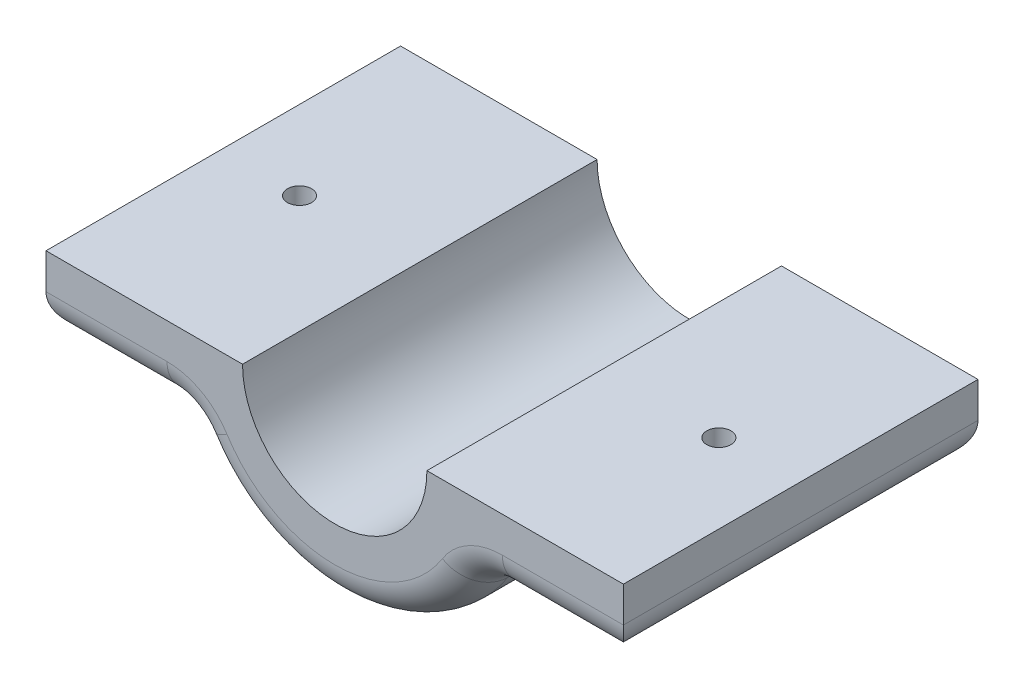
ISO-10303-21;
HEADER;
FILE_DESCRIPTION(('STEP AP214'),'2;1');
FILE_NAME('part.step','',(''),(''),'','','');
FILE_SCHEMA(('AUTOMOTIVE_DESIGN { 1 0 10303 214 1 1 1 1 }'));
ENDSEC;
DATA;
#1=APPLICATION_CONTEXT('core data for automotive mechanical design processes');
#2=APPLICATION_PROTOCOL_DEFINITION('international standard','automotive_design',2000,#1);
#3=PRODUCT_CONTEXT('',#1,'mechanical');
#4=PRODUCT('Part','Part','',(#3));
#5=PRODUCT_RELATED_PRODUCT_CATEGORY('part','',(#4));
#6=PRODUCT_DEFINITION_FORMATION('','',#4);
#7=PRODUCT_DEFINITION_CONTEXT('part definition',#1,'design');
#8=PRODUCT_DEFINITION('design','',#6,#7);
#9=PRODUCT_DEFINITION_SHAPE('','',#8);
#10=(LENGTH_UNIT() NAMED_UNIT(*) SI_UNIT(.MILLI.,.METRE.));
#11=(NAMED_UNIT(*) PLANE_ANGLE_UNIT() SI_UNIT($,.RADIAN.));
#12=(NAMED_UNIT(*) SI_UNIT($,.STERADIAN.) SOLID_ANGLE_UNIT());
#13=UNCERTAINTY_MEASURE_WITH_UNIT(LENGTH_MEASURE(1.E-05),#10,'distance_accuracy_value','');
#14=(GEOMETRIC_REPRESENTATION_CONTEXT(3) GLOBAL_UNCERTAINTY_ASSIGNED_CONTEXT((#13)) GLOBAL_UNIT_ASSIGNED_CONTEXT((#10,
#11,#12)) REPRESENTATION_CONTEXT('',''));
#15=CARTESIAN_POINT('',(0.,0.,0.));
#16=DIRECTION('',(0.,0.,1.));
#17=DIRECTION('',(1.,0.,0.));
#18=AXIS2_PLACEMENT_3D('',#15,#16,#17);
#19=CARTESIAN_POINT('',(0.,0.,0.));
#20=DIRECTION('',(0.,1.,0.));
#21=DIRECTION('',(0.,0.,1.));
#22=AXIS2_PLACEMENT_3D('',#19,#20,#21);
#23=PLANE('',#22);
#24=DIRECTION('',(0.,0.,1.));
#25=VECTOR('',#24,1.);
#26=CARTESIAN_POINT('',(-40.712315177208,0.,50.));
#27=LINE('',#26,#25);
#28=CARTESIAN_POINT('',(-40.712315177208,0.,0.));
#29=VERTEX_POINT('',#28);
#30=CARTESIAN_POINT('',(-40.712315177208,0.,50.));
#31=VERTEX_POINT('',#30);
#32=EDGE_CURVE('E185',#29,#31,#27,.T.);
#33=ORIENTED_EDGE('',*,*,#32,.T.);
#34=DIRECTION('',(1.,0.,0.));
#35=VECTOR('',#34,1.);
#36=CARTESIAN_POINT('',(0.,0.,50.));
#37=LINE('',#36,#35);
#38=CARTESIAN_POINT('',(-13.,0.,50.));
#39=VERTEX_POINT('',#38);
#40=EDGE_CURVE('E162',#31,#39,#37,.T.);
#41=ORIENTED_EDGE('',*,*,#40,.T.);
#42=DIRECTION('',(0.,0.,-1.));
#43=VECTOR('',#42,1.);
#44=CARTESIAN_POINT('',(-13.,0.,50.));
#45=LINE('',#44,#43);
#46=CARTESIAN_POINT('',(-13.,0.,0.));
#47=VERTEX_POINT('',#46);
#48=EDGE_CURVE('E174',#39,#47,#45,.T.);
#49=ORIENTED_EDGE('',*,*,#48,.T.);
#50=DIRECTION('',(1.,0.,0.));
#51=VECTOR('',#50,1.);
#52=CARTESIAN_POINT('',(0.,0.,0.));
#53=LINE('',#52,#51);
#54=EDGE_CURVE('E360',#29,#47,#53,.T.);
#55=ORIENTED_EDGE('',*,*,#54,.F.);
#56=EDGE_LOOP('',(#33,#41,#49,#55));
#57=FACE_BOUND('',#56,.T.);
#58=CARTESIAN_POINT('',(-29.5627354631344,0.,25.3975173204526));
#59=DIRECTION('',(0.,1.,0.));
#60=DIRECTION('',(0.,0.,1.));
#61=AXIS2_PLACEMENT_3D('',#58,#59,#60);
#62=CIRCLE('',#61,1.7);
#63=CARTESIAN_POINT('',(-29.5627354631344,0.,27.0975173204526));
#64=VERTEX_POINT('',#63);
#65=EDGE_CURVE('E191',#64,#64,#62,.F.);
#66=ORIENTED_EDGE('',*,*,#65,.T.);
#67=EDGE_LOOP('',(#66));
#68=FACE_BOUND('',#67,.T.);
#69=ADVANCED_FACE('F43',(#57,#68),#23,.T.);
#70=DIRECTION('',(0.,0.,-1.));
#71=VECTOR('',#70,1.);
#72=CARTESIAN_POINT('',(13.,0.,50.));
#73=LINE('',#72,#71);
#74=CARTESIAN_POINT('',(13.,0.,0.));
#75=VERTEX_POINT('',#74);
#76=CARTESIAN_POINT('',(13.,0.,50.));
#77=VERTEX_POINT('',#76);
#78=EDGE_CURVE('E179',#75,#77,#73,.F.);
#79=ORIENTED_EDGE('',*,*,#78,.T.);
#80=CARTESIAN_POINT('',(40.712315177208,0.,50.));
#81=VERTEX_POINT('',#80);
#82=EDGE_CURVE('E164',#77,#81,#37,.T.);
#83=ORIENTED_EDGE('',*,*,#82,.T.);
#84=DIRECTION('',(0.,0.,-1.));
#85=VECTOR('',#84,1.);
#86=CARTESIAN_POINT('',(40.712315177208,0.,50.));
#87=LINE('',#86,#85);
#88=CARTESIAN_POINT('',(40.712315177208,0.,0.));
#89=VERTEX_POINT('',#88);
#90=EDGE_CURVE('E180',#81,#89,#87,.T.);
#91=ORIENTED_EDGE('',*,*,#90,.T.);
#92=EDGE_CURVE('E284',#75,#89,#53,.T.);
#93=ORIENTED_EDGE('',*,*,#92,.F.);
#94=EDGE_LOOP('',(#79,#83,#91,#93));
#95=FACE_BOUND('',#94,.T.);
#96=CARTESIAN_POINT('',(29.5627354631344,0.,25.3975173204526));
#97=DIRECTION('',(0.,1.,0.));
#98=DIRECTION('',(0.,0.,1.));
#99=AXIS2_PLACEMENT_3D('',#96,#97,#98);
#100=CIRCLE('',#99,1.7);
#101=CARTESIAN_POINT('',(29.5627354631344,0.,27.0975173204526));
#102=VERTEX_POINT('',#101);
#103=EDGE_CURVE('E197',#102,#102,#100,.F.);
#104=ORIENTED_EDGE('',*,*,#103,.T.);
#105=EDGE_LOOP('',(#104));
#106=FACE_BOUND('',#105,.T.);
#107=ADVANCED_FACE('F367',(#95,#106),#23,.T.);
#108=CARTESIAN_POINT('',(0.,0.,50.));
#109=DIRECTION('',(0.,0.,-1.));
#110=DIRECTION('',(-1.,0.,0.));
#111=AXIS2_PLACEMENT_3D('',#108,#109,#110);
#112=CYLINDRICAL_SURFACE('',#111,13.);
#113=ORIENTED_EDGE('',*,*,#78,.F.);
#114=CARTESIAN_POINT('',(0.,0.,0.));
#115=DIRECTION('',(0.,0.,-1.));
#116=DIRECTION('',(-1.,0.,0.));
#117=AXIS2_PLACEMENT_3D('',#114,#115,#116);
#118=CIRCLE('',#117,13.);
#119=EDGE_CURVE('E47',#75,#47,#118,.T.);
#120=ORIENTED_EDGE('',*,*,#119,.T.);
#121=ORIENTED_EDGE('',*,*,#48,.F.);
#122=CARTESIAN_POINT('',(0.,0.,50.));
#123=DIRECTION('',(0.,0.,-1.));
#124=DIRECTION('',(-1.,0.,0.));
#125=AXIS2_PLACEMENT_3D('',#122,#123,#124);
#126=CIRCLE('',#125,13.);
#127=EDGE_CURVE('E159',#77,#39,#126,.T.);
#128=ORIENTED_EDGE('',*,*,#127,.F.);
#129=EDGE_LOOP('',(#113,#120,#121,#128));
#130=FACE_BOUND('',#129,.T.);
#131=ADVANCED_FACE('F175',(#130),#112,.F.);
#132=CARTESIAN_POINT('',(40.712315177208,10.,50.));
#133=DIRECTION('',(-1.,0.,0.));
#134=DIRECTION('',(0.,0.,1.));
#135=AXIS2_PLACEMENT_3D('',#132,#133,#134);
#136=PLANE('',#135);
#137=ORIENTED_EDGE('',*,*,#90,.F.);
#138=DIRECTION('',(0.,1.,0.));
#139=VECTOR('',#138,1.);
#140=CARTESIAN_POINT('',(40.712315177208,10.,50.));
#141=LINE('',#140,#139);
#142=CARTESIAN_POINT('',(40.712315177208,-5.,50.));
#143=VERTEX_POINT('',#142);
#144=EDGE_CURVE('E170',#143,#81,#141,.T.);
#145=ORIENTED_EDGE('',*,*,#144,.F.);
#146=DIRECTION('',(0.,0.,-1.));
#147=VECTOR('',#146,1.);
#148=CARTESIAN_POINT('',(40.712315177208,-5.,0.));
#149=LINE('',#148,#147);
#150=CARTESIAN_POINT('',(40.712315177208,-5.,0.));
#151=VERTEX_POINT('',#150);
#152=EDGE_CURVE('E280',#143,#151,#149,.T.);
#153=ORIENTED_EDGE('',*,*,#152,.T.);
#154=DIRECTION('',(0.,1.,0.));
#155=VECTOR('',#154,1.);
#156=CARTESIAN_POINT('',(40.712315177208,10.,0.));
#157=LINE('',#156,#155);
#158=EDGE_CURVE('E207',#151,#89,#157,.T.);
#159=ORIENTED_EDGE('',*,*,#158,.T.);
#160=EDGE_LOOP('',(#137,#145,#153,#159));
#161=FACE_BOUND('',#160,.T.);
#162=ADVANCED_FACE('F370',(#161),#136,.F.);
#163=CARTESIAN_POINT('',(-40.712315177208,10.,50.));
#164=DIRECTION('',(1.,0.,0.));
#165=DIRECTION('',(0.,0.,-1.));
#166=AXIS2_PLACEMENT_3D('',#163,#164,#165);
#167=PLANE('',#166);
#168=ORIENTED_EDGE('',*,*,#32,.F.);
#169=DIRECTION('',(0.,-1.,0.));
#170=VECTOR('',#169,1.);
#171=CARTESIAN_POINT('',(-40.712315177208,10.,0.));
#172=LINE('',#171,#170);
#173=CARTESIAN_POINT('',(-40.712315177208,-5.,0.));
#174=VERTEX_POINT('',#173);
#175=EDGE_CURVE('E169',#29,#174,#172,.T.);
#176=ORIENTED_EDGE('',*,*,#175,.T.);
#177=DIRECTION('',(0.,0.,-1.));
#178=VECTOR('',#177,1.);
#179=CARTESIAN_POINT('',(-40.712315177208,-5.,50.));
#180=LINE('',#179,#178);
#181=CARTESIAN_POINT('',(-40.712315177208,-5.,50.));
#182=VERTEX_POINT('',#181);
#183=EDGE_CURVE('E297',#174,#182,#180,.F.);
#184=ORIENTED_EDGE('',*,*,#183,.T.);
#185=DIRECTION('',(0.,-1.,0.));
#186=VECTOR('',#185,1.);
#187=CARTESIAN_POINT('',(-40.712315177208,10.,50.));
#188=LINE('',#187,#186);
#189=EDGE_CURVE('E201',#31,#182,#188,.T.);
#190=ORIENTED_EDGE('',*,*,#189,.F.);
#191=EDGE_LOOP('',(#168,#176,#184,#190));
#192=FACE_BOUND('',#191,.T.);
#193=ADVANCED_FACE('F398',(#192),#167,.F.);
#194=CARTESIAN_POINT('',(0.,0.,50.));
#195=DIRECTION('',(0.,0.,-1.));
#196=DIRECTION('',(-1.,0.,0.));
#197=AXIS2_PLACEMENT_3D('',#194,#195,#196);
#198=PLANE('',#197);
#199=ORIENTED_EDGE('',*,*,#40,.F.);
#200=ORIENTED_EDGE('',*,*,#189,.T.);
#201=DIRECTION('',(-1.,0.,0.));
#202=VECTOR('',#201,1.);
#203=CARTESIAN_POINT('',(-20.712315177208,-5.,50.));
#204=LINE('',#203,#202);
#205=CARTESIAN_POINT('',(-23.6431808350738,-5.,50.));
#206=VERTEX_POINT('',#205);
#207=EDGE_CURVE('E332',#182,#206,#204,.F.);
#208=ORIENTED_EDGE('',*,*,#207,.T.);
#209=CARTESIAN_POINT('',(-23.6431808350738,-15.,50.));
#210=DIRECTION('',(0.,0.,-1.));
#211=DIRECTION('',(-1.,0.,0.));
#212=AXIS2_PLACEMENT_3D('',#209,#210,#211);
#213=CIRCLE('',#212,10.);
#214=CARTESIAN_POINT('',(-15.1991876796903,-9.64285714285714,50.));
#215=VERTEX_POINT('',#214);
#216=EDGE_CURVE('E335',#215,#206,#213,.F.);
#217=ORIENTED_EDGE('',*,*,#216,.F.);
#218=CARTESIAN_POINT('',(0.,0.,50.));
#219=DIRECTION('',(0.,0.,-1.));
#220=DIRECTION('',(-1.,0.,0.));
#221=AXIS2_PLACEMENT_3D('',#218,#219,#220);
#222=CIRCLE('',#221,18.);
#223=CARTESIAN_POINT('',(15.1991876796903,-9.64285714285714,50.));
#224=VERTEX_POINT('',#223);
#225=EDGE_CURVE('E339',#215,#224,#222,.F.);
#226=ORIENTED_EDGE('',*,*,#225,.T.);
#227=CARTESIAN_POINT('',(23.6431808350738,-15.,50.));
#228=DIRECTION('',(0.,0.,-1.));
#229=DIRECTION('',(-1.,0.,0.));
#230=AXIS2_PLACEMENT_3D('',#227,#228,#229);
#231=CIRCLE('',#230,10.);
#232=CARTESIAN_POINT('',(23.6431808350738,-5.,50.));
#233=VERTEX_POINT('',#232);
#234=EDGE_CURVE('E343',#233,#224,#231,.F.);
#235=ORIENTED_EDGE('',*,*,#234,.F.);
#236=DIRECTION('',(-1.,0.,0.));
#237=VECTOR('',#236,1.);
#238=CARTESIAN_POINT('',(40.712315177208,-5.,50.));
#239=LINE('',#238,#237);
#240=EDGE_CURVE('E347',#233,#143,#239,.F.);
#241=ORIENTED_EDGE('',*,*,#240,.T.);
#242=ORIENTED_EDGE('',*,*,#144,.T.);
#243=ORIENTED_EDGE('',*,*,#82,.F.);
#244=ORIENTED_EDGE('',*,*,#127,.T.);
#245=EDGE_LOOP('',(#199,#200,#208,#217,#226,#235,#241,#242,#243,#244));
#246=FACE_BOUND('',#245,.T.);
#247=ADVANCED_FACE('F45',(#246),#198,.F.);
#248=CARTESIAN_POINT('',(0.,0.,0.));
#249=DIRECTION('',(0.,0.,-1.));
#250=DIRECTION('',(-1.,0.,0.));
#251=AXIS2_PLACEMENT_3D('',#248,#249,#250);
#252=PLANE('',#251);
#253=ORIENTED_EDGE('',*,*,#175,.F.);
#254=ORIENTED_EDGE('',*,*,#54,.T.);
#255=ORIENTED_EDGE('',*,*,#119,.F.);
#256=ORIENTED_EDGE('',*,*,#92,.T.);
#257=ORIENTED_EDGE('',*,*,#158,.F.);
#258=DIRECTION('',(-1.,0.,0.));
#259=VECTOR('',#258,1.);
#260=CARTESIAN_POINT('',(0.,-5.,0.));
#261=LINE('',#260,#259);
#262=CARTESIAN_POINT('',(23.6431808350738,-5.,0.));
#263=VERTEX_POINT('',#262);
#264=EDGE_CURVE('E325',#151,#263,#261,.T.);
#265=ORIENTED_EDGE('',*,*,#264,.T.);
#266=CARTESIAN_POINT('',(23.6431808350738,-15.,0.));
#267=DIRECTION('',(0.,0.,-1.));
#268=DIRECTION('',(-1.,0.,0.));
#269=AXIS2_PLACEMENT_3D('',#266,#267,#268);
#270=CIRCLE('',#269,10.);
#271=CARTESIAN_POINT('',(15.1991876796903,-9.64285714285714,0.));
#272=VERTEX_POINT('',#271);
#273=EDGE_CURVE('E328',#272,#263,#270,.T.);
#274=ORIENTED_EDGE('',*,*,#273,.F.);
#275=CARTESIAN_POINT('',(0.,0.,0.));
#276=DIRECTION('',(0.,0.,-1.));
#277=DIRECTION('',(-1.,0.,0.));
#278=AXIS2_PLACEMENT_3D('',#275,#276,#277);
#279=CIRCLE('',#278,18.);
#280=CARTESIAN_POINT('',(-15.1991876796903,-9.64285714285714,0.));
#281=VERTEX_POINT('',#280);
#282=EDGE_CURVE('E322',#272,#281,#279,.T.);
#283=ORIENTED_EDGE('',*,*,#282,.T.);
#284=CARTESIAN_POINT('',(-23.6431808350738,-15.,0.));
#285=DIRECTION('',(0.,0.,-1.));
#286=DIRECTION('',(-1.,0.,0.));
#287=AXIS2_PLACEMENT_3D('',#284,#285,#286);
#288=CIRCLE('',#287,10.);
#289=CARTESIAN_POINT('',(-23.6431808350738,-5.,0.));
#290=VERTEX_POINT('',#289);
#291=EDGE_CURVE('E318',#290,#281,#288,.T.);
#292=ORIENTED_EDGE('',*,*,#291,.F.);
#293=DIRECTION('',(-1.,0.,0.));
#294=VECTOR('',#293,1.);
#295=CARTESIAN_POINT('',(0.,-5.,0.));
#296=LINE('',#295,#294);
#297=EDGE_CURVE('E314',#290,#174,#296,.T.);
#298=ORIENTED_EDGE('',*,*,#297,.T.);
#299=EDGE_LOOP('',(#253,#254,#255,#256,#257,#265,#274,#283,#292,#298));
#300=FACE_BOUND('',#299,.T.);
#301=ADVANCED_FACE('F394',(#300),#252,.T.);
#302=CARTESIAN_POINT('',(-29.5627354631344,10.,25.3975173204526));
#303=DIRECTION('',(0.,1.,0.));
#304=DIRECTION('',(0.,0.,1.));
#305=AXIS2_PLACEMENT_3D('',#302,#303,#304);
#306=CYLINDRICAL_SURFACE('',#305,1.7);
#307=CARTESIAN_POINT('',(-29.5627354631344,-10.,25.3975173204526));
#308=DIRECTION('',(0.,-1.,0.));
#309=DIRECTION('',(0.,0.,-1.));
#310=AXIS2_PLACEMENT_3D('',#307,#308,#309);
#311=CIRCLE('',#310,1.7);
#312=CARTESIAN_POINT('',(-29.5627354631344,-10.,23.6975173204526));
#313=VERTEX_POINT('',#312);
#314=EDGE_CURVE('E53',#313,#313,#311,.T.);
#315=ORIENTED_EDGE('',*,*,#314,.T.);
#316=EDGE_LOOP('',(#315));
#317=FACE_BOUND('',#316,.T.);
#318=ORIENTED_EDGE('',*,*,#65,.F.);
#319=EDGE_LOOP('',(#318));
#320=FACE_BOUND('',#319,.T.);
#321=ADVANCED_FACE('F435',(#317,#320),#306,.F.);
#322=CARTESIAN_POINT('',(29.5627354631344,10.,25.3975173204526));
#323=DIRECTION('',(0.,1.,0.));
#324=DIRECTION('',(0.,0.,1.));
#325=AXIS2_PLACEMENT_3D('',#322,#323,#324);
#326=CYLINDRICAL_SURFACE('',#325,1.7);
#327=CARTESIAN_POINT('',(29.5627354631344,-10.,25.3975173204526));
#328=DIRECTION('',(0.,-1.,0.));
#329=DIRECTION('',(0.,0.,-1.));
#330=AXIS2_PLACEMENT_3D('',#327,#328,#329);
#331=CIRCLE('',#330,1.7);
#332=CARTESIAN_POINT('',(29.5627354631344,-10.,23.6975173204526));
#333=VERTEX_POINT('',#332);
#334=EDGE_CURVE('E11',#333,#333,#331,.T.);
#335=ORIENTED_EDGE('',*,*,#334,.T.);
#336=EDGE_LOOP('',(#335));
#337=FACE_BOUND('',#336,.T.);
#338=ORIENTED_EDGE('',*,*,#103,.F.);
#339=EDGE_LOOP('',(#338));
#340=FACE_BOUND('',#339,.T.);
#341=ADVANCED_FACE('F444',(#337,#340),#326,.F.);
#342=CARTESIAN_POINT('',(-20.712315177208,-10.,50.));
#343=DIRECTION('',(0.,-1.,0.));
#344=DIRECTION('',(0.,0.,-1.));
#345=AXIS2_PLACEMENT_3D('',#342,#343,#344);
#346=PLANE('',#345);
#347=ORIENTED_EDGE('',*,*,#314,.F.);
#348=EDGE_LOOP('',(#347));
#349=FACE_BOUND('',#348,.T.);
#350=DIRECTION('',(-1.,0.,0.));
#351=VECTOR('',#350,1.);
#352=CARTESIAN_POINT('',(-40.712315177208,-10.,45.));
#353=LINE('',#352,#351);
#354=CARTESIAN_POINT('',(-23.6431808350738,-10.,45.));
#355=VERTEX_POINT('',#354);
#356=CARTESIAN_POINT('',(-35.712315177208,-10.,45.));
#357=VERTEX_POINT('',#356);
#358=EDGE_CURVE('E305',#355,#357,#353,.T.);
#359=ORIENTED_EDGE('',*,*,#358,.T.);
#360=DIRECTION('',(0.,0.,-1.));
#361=VECTOR('',#360,1.);
#362=CARTESIAN_POINT('',(-35.712315177208,-10.,0.));
#363=LINE('',#362,#361);
#364=CARTESIAN_POINT('',(-35.712315177208,-10.,5.));
#365=VERTEX_POINT('',#364);
#366=EDGE_CURVE('E301',#357,#365,#363,.T.);
#367=ORIENTED_EDGE('',*,*,#366,.T.);
#368=DIRECTION('',(-1.,0.,0.));
#369=VECTOR('',#368,1.);
#370=CARTESIAN_POINT('',(-20.712315177208,-10.,5.));
#371=LINE('',#370,#369);
#372=CARTESIAN_POINT('',(-23.6431808350738,-10.,5.));
#373=VERTEX_POINT('',#372);
#374=EDGE_CURVE('E311',#365,#373,#371,.F.);
#375=ORIENTED_EDGE('',*,*,#374,.T.);
#376=DIRECTION('',(0.,0.,1.));
#377=VECTOR('',#376,1.);
#378=CARTESIAN_POINT('',(-23.6431808350738,-10.,50.));
#379=LINE('',#378,#377);
#380=EDGE_CURVE('E308',#373,#355,#379,.T.);
#381=ORIENTED_EDGE('',*,*,#380,.T.);
#382=EDGE_LOOP('',(#359,#367,#375,#381));
#383=FACE_BOUND('',#382,.T.);
#384=ADVANCED_FACE('F594',(#349,#383),#346,.T.);
#385=CARTESIAN_POINT('',(0.,0.,50.));
#386=DIRECTION('',(0.,0.,-1.));
#387=DIRECTION('',(-1.,0.,0.));
#388=AXIS2_PLACEMENT_3D('',#385,#386,#387);
#389=CYLINDRICAL_SURFACE('',#388,23.);
#390=CARTESIAN_POINT('',(0.,0.,45.));
#391=DIRECTION('',(0.,0.,-1.));
#392=DIRECTION('',(-1.,0.,0.));
#393=AXIS2_PLACEMENT_3D('',#390,#391,#392);
#394=CIRCLE('',#393,23.);
#395=CARTESIAN_POINT('',(19.421184257382,-12.3214285714286,45.));
#396=VERTEX_POINT('',#395);
#397=CARTESIAN_POINT('',(-19.421184257382,-12.3214285714286,45.));
#398=VERTEX_POINT('',#397);
#399=EDGE_CURVE('E353',#396,#398,#394,.T.);
#400=ORIENTED_EDGE('',*,*,#399,.T.);
#401=DIRECTION('',(0.,0.,-1.));
#402=VECTOR('',#401,1.);
#403=CARTESIAN_POINT('',(-19.421184257382,-12.3214285714286,50.));
#404=LINE('',#403,#402);
#405=CARTESIAN_POINT('',(-19.421184257382,-12.3214285714286,5.));
#406=VERTEX_POINT('',#405);
#407=EDGE_CURVE('E350',#398,#406,#404,.T.);
#408=ORIENTED_EDGE('',*,*,#407,.T.);
#409=CARTESIAN_POINT('',(0.,0.,5.));
#410=DIRECTION('',(0.,0.,-1.));
#411=DIRECTION('',(-1.,0.,0.));
#412=AXIS2_PLACEMENT_3D('',#409,#410,#411);
#413=CIRCLE('',#412,23.);
#414=CARTESIAN_POINT('',(19.421184257382,-12.3214285714286,5.));
#415=VERTEX_POINT('',#414);
#416=EDGE_CURVE('E61',#406,#415,#413,.F.);
#417=ORIENTED_EDGE('',*,*,#416,.T.);
#418=DIRECTION('',(0.,0.,-1.));
#419=VECTOR('',#418,1.);
#420=CARTESIAN_POINT('',(19.421184257382,-12.3214285714286,50.));
#421=LINE('',#420,#419);
#422=EDGE_CURVE('E66',#415,#396,#421,.F.);
#423=ORIENTED_EDGE('',*,*,#422,.T.);
#424=EDGE_LOOP('',(#400,#408,#417,#423));
#425=FACE_BOUND('',#424,.T.);
#426=ADVANCED_FACE('F585',(#425),#389,.T.);
#427=CARTESIAN_POINT('',(20.712315177208,-10.,50.));
#428=DIRECTION('',(0.,-1.,0.));
#429=DIRECTION('',(0.,0.,-1.));
#430=AXIS2_PLACEMENT_3D('',#427,#428,#429);
#431=PLANE('',#430);
#432=ORIENTED_EDGE('',*,*,#334,.F.);
#433=EDGE_LOOP('',(#432));
#434=FACE_BOUND('',#433,.T.);
#435=DIRECTION('',(-1.,0.,0.));
#436=VECTOR('',#435,1.);
#437=CARTESIAN_POINT('',(20.712315177208,-10.,45.));
#438=LINE('',#437,#436);
#439=CARTESIAN_POINT('',(35.712315177208,-10.,45.));
#440=VERTEX_POINT('',#439);
#441=CARTESIAN_POINT('',(23.6431808350738,-10.,45.));
#442=VERTEX_POINT('',#441);
#443=EDGE_CURVE('E288',#440,#442,#438,.T.);
#444=ORIENTED_EDGE('',*,*,#443,.T.);
#445=DIRECTION('',(0.,0.,1.));
#446=VECTOR('',#445,1.);
#447=CARTESIAN_POINT('',(23.6431808350738,-10.,0.));
#448=LINE('',#447,#446);
#449=CARTESIAN_POINT('',(23.6431808350738,-10.,5.));
#450=VERTEX_POINT('',#449);
#451=EDGE_CURVE('E283',#442,#450,#448,.F.);
#452=ORIENTED_EDGE('',*,*,#451,.T.);
#453=DIRECTION('',(-1.,0.,0.));
#454=VECTOR('',#453,1.);
#455=CARTESIAN_POINT('',(20.712315177208,-10.,5.));
#456=LINE('',#455,#454);
#457=CARTESIAN_POINT('',(35.712315177208,-10.,5.));
#458=VERTEX_POINT('',#457);
#459=EDGE_CURVE('E294',#450,#458,#456,.F.);
#460=ORIENTED_EDGE('',*,*,#459,.T.);
#461=DIRECTION('',(0.,0.,-1.));
#462=VECTOR('',#461,1.);
#463=CARTESIAN_POINT('',(35.712315177208,-10.,50.));
#464=LINE('',#463,#462);
#465=EDGE_CURVE('E291',#458,#440,#464,.F.);
#466=ORIENTED_EDGE('',*,*,#465,.T.);
#467=EDGE_LOOP('',(#444,#452,#460,#466));
#468=FACE_BOUND('',#467,.T.);
#469=ADVANCED_FACE('F380',(#434,#468),#431,.T.);
#470=CARTESIAN_POINT('',(0.,-5.,5.));
#471=DIRECTION('',(-1.,0.,0.));
#472=DIRECTION('',(0.,0.,1.));
#473=AXIS2_PLACEMENT_3D('',#470,#471,#472);
#474=CYLINDRICAL_SURFACE('',#473,5.);
#475=CARTESIAN_POINT('',(23.6431808350738,-5.,5.));
#476=DIRECTION('',(-1.,0.,0.));
#477=DIRECTION('',(0.,0.,1.));
#478=AXIS2_PLACEMENT_3D('',#475,#476,#477);
#479=CIRCLE('',#478,5.);
#480=EDGE_CURVE('E217',#263,#450,#479,.T.);
#481=ORIENTED_EDGE('',*,*,#480,.F.);
#482=ORIENTED_EDGE('',*,*,#264,.F.);
#483=CARTESIAN_POINT('',(35.712315177208,-5.,5.));
#484=DIRECTION('',(-0.707106781186547,0.,-0.707106781186547));
#485=DIRECTION('',(-0.707106781186547,0.,0.707106781186547));
#486=AXIS2_PLACEMENT_3D('',#483,#484,#485);
#487=ELLIPSE('',#486,7.07106781186547,5.);
#488=EDGE_CURVE('E214',#458,#151,#487,.F.);
#489=ORIENTED_EDGE('',*,*,#488,.F.);
#490=ORIENTED_EDGE('',*,*,#459,.F.);
#491=EDGE_LOOP('',(#481,#482,#489,#490));
#492=FACE_BOUND('',#491,.T.);
#493=ADVANCED_FACE('F391',(#492),#474,.T.);
#494=CARTESIAN_POINT('',(0.,0.,5.));
#495=DIRECTION('',(0.,0.,-1.));
#496=DIRECTION('',(-1.,0.,0.));
#497=AXIS2_PLACEMENT_3D('',#494,#495,#496);
#498=TOROIDAL_SURFACE('',#497,18.,5.);
#499=CARTESIAN_POINT('',(-15.1991876796903,-9.64285714285714,5.));
#500=DIRECTION('',(-0.535714285714285,0.844399315538349,0.));
#501=DIRECTION('',(-0.844399315538349,-0.535714285714285,0.));
#502=AXIS2_PLACEMENT_3D('',#499,#500,#501);
#503=CIRCLE('',#502,5.);
#504=EDGE_CURVE('E232',#281,#406,#503,.T.);
#505=ORIENTED_EDGE('',*,*,#504,.F.);
#506=ORIENTED_EDGE('',*,*,#282,.F.);
#507=CARTESIAN_POINT('',(15.1991876796903,-9.64285714285714,5.));
#508=DIRECTION('',(0.535714285714285,0.844399315538349,0.));
#509=DIRECTION('',(-0.844399315538349,0.535714285714285,0.));
#510=AXIS2_PLACEMENT_3D('',#507,#508,#509);
#511=CIRCLE('',#510,5.);
#512=EDGE_CURVE('E225',#415,#272,#511,.T.);
#513=ORIENTED_EDGE('',*,*,#512,.F.);
#514=ORIENTED_EDGE('',*,*,#416,.F.);
#515=EDGE_LOOP('',(#505,#506,#513,#514));
#516=FACE_BOUND('',#515,.T.);
#517=ADVANCED_FACE('F561',(#516),#498,.T.);
#518=CARTESIAN_POINT('',(0.,-5.,5.));
#519=DIRECTION('',(-1.,0.,0.));
#520=DIRECTION('',(0.,0.,1.));
#521=AXIS2_PLACEMENT_3D('',#518,#519,#520);
#522=CYLINDRICAL_SURFACE('',#521,5.);
#523=CARTESIAN_POINT('',(-35.712315177208,-5.,5.));
#524=DIRECTION('',(-0.707106781186547,0.,0.707106781186547));
#525=DIRECTION('',(-0.707106781186547,0.,-0.707106781186547));
#526=AXIS2_PLACEMENT_3D('',#523,#524,#525);
#527=ELLIPSE('',#526,7.07106781186547,5.);
#528=EDGE_CURVE('E240',#174,#365,#527,.T.);
#529=ORIENTED_EDGE('',*,*,#528,.F.);
#530=ORIENTED_EDGE('',*,*,#297,.F.);
#531=CARTESIAN_POINT('',(-23.6431808350738,-5.,5.));
#532=DIRECTION('',(1.,0.,0.));
#533=DIRECTION('',(0.,0.,-1.));
#534=AXIS2_PLACEMENT_3D('',#531,#532,#533);
#535=CIRCLE('',#534,5.);
#536=EDGE_CURVE('E236',#373,#290,#535,.T.);
#537=ORIENTED_EDGE('',*,*,#536,.F.);
#538=ORIENTED_EDGE('',*,*,#374,.F.);
#539=EDGE_LOOP('',(#529,#530,#537,#538));
#540=FACE_BOUND('',#539,.T.);
#541=ADVANCED_FACE('F553',(#540),#522,.T.);
#542=CARTESIAN_POINT('',(35.712315177208,-5.,50.));
#543=DIRECTION('',(0.,0.,1.));
#544=DIRECTION('',(1.,0.,0.));
#545=AXIS2_PLACEMENT_3D('',#542,#543,#544);
#546=CYLINDRICAL_SURFACE('',#545,5.);
#547=ORIENTED_EDGE('',*,*,#488,.T.);
#548=ORIENTED_EDGE('',*,*,#152,.F.);
#549=CARTESIAN_POINT('',(35.712315177208,-5.,45.));
#550=DIRECTION('',(-0.707106781186547,0.,0.707106781186547));
#551=DIRECTION('',(0.707106781186547,0.,0.707106781186547));
#552=AXIS2_PLACEMENT_3D('',#549,#550,#551);
#553=ELLIPSE('',#552,7.07106781186547,5.);
#554=EDGE_CURVE('E243',#440,#143,#553,.T.);
#555=ORIENTED_EDGE('',*,*,#554,.F.);
#556=ORIENTED_EDGE('',*,*,#465,.F.);
#557=EDGE_LOOP('',(#547,#548,#555,#556));
#558=FACE_BOUND('',#557,.T.);
#559=ADVANCED_FACE('F372',(#558),#546,.T.);
#560=CARTESIAN_POINT('',(23.6431808350738,-15.,5.));
#561=DIRECTION('',(0.,0.,-1.));
#562=DIRECTION('',(-1.,0.,0.));
#563=AXIS2_PLACEMENT_3D('',#560,#561,#562);
#564=TOROIDAL_SURFACE('',#563,10.,5.);
#565=ORIENTED_EDGE('',*,*,#273,.T.);
#566=ORIENTED_EDGE('',*,*,#480,.T.);
#567=CARTESIAN_POINT('',(23.6431808350738,-15.,5.));
#568=DIRECTION('',(0.,0.,-1.));
#569=DIRECTION('',(-1.,0.,0.));
#570=AXIS2_PLACEMENT_3D('',#567,#568,#569);
#571=CIRCLE('',#570,5.);
#572=EDGE_CURVE('E247',#415,#450,#571,.T.);
#573=ORIENTED_EDGE('',*,*,#572,.F.);
#574=ORIENTED_EDGE('',*,*,#512,.T.);
#575=EDGE_LOOP('',(#565,#566,#573,#574));
#576=FACE_BOUND('',#575,.T.);
#577=ADVANCED_FACE('F388',(#576),#564,.T.);
#578=CARTESIAN_POINT('',(-23.6431808350738,-15.,5.));
#579=DIRECTION('',(0.,0.,-1.));
#580=DIRECTION('',(-1.,0.,0.));
#581=AXIS2_PLACEMENT_3D('',#578,#579,#580);
#582=TOROIDAL_SURFACE('',#581,10.,5.);
#583=ORIENTED_EDGE('',*,*,#291,.T.);
#584=ORIENTED_EDGE('',*,*,#504,.T.);
#585=CARTESIAN_POINT('',(-23.6431808350738,-15.,5.));
#586=DIRECTION('',(0.,0.,-1.));
#587=DIRECTION('',(-1.,0.,0.));
#588=AXIS2_PLACEMENT_3D('',#585,#586,#587);
#589=CIRCLE('',#588,5.);
#590=EDGE_CURVE('E250',#373,#406,#589,.T.);
#591=ORIENTED_EDGE('',*,*,#590,.F.);
#592=ORIENTED_EDGE('',*,*,#536,.T.);
#593=EDGE_LOOP('',(#583,#584,#591,#592));
#594=FACE_BOUND('',#593,.T.);
#595=ADVANCED_FACE('F529',(#594),#582,.T.);
#596=CARTESIAN_POINT('',(-35.712315177208,-5.,50.));
#597=DIRECTION('',(0.,0.,1.));
#598=DIRECTION('',(1.,0.,0.));
#599=AXIS2_PLACEMENT_3D('',#596,#597,#598);
#600=CYLINDRICAL_SURFACE('',#599,5.);
#601=ORIENTED_EDGE('',*,*,#528,.T.);
#602=ORIENTED_EDGE('',*,*,#366,.F.);
#603=CARTESIAN_POINT('',(-35.712315177208,-5.,45.));
#604=DIRECTION('',(0.707106781186547,0.,0.707106781186547));
#605=DIRECTION('',(0.707106781186547,0.,-0.707106781186547));
#606=AXIS2_PLACEMENT_3D('',#603,#604,#605);
#607=ELLIPSE('',#606,7.07106781186547,5.);
#608=EDGE_CURVE('E254',#182,#357,#607,.T.);
#609=ORIENTED_EDGE('',*,*,#608,.F.);
#610=ORIENTED_EDGE('',*,*,#183,.F.);
#611=EDGE_LOOP('',(#601,#602,#609,#610));
#612=FACE_BOUND('',#611,.T.);
#613=ADVANCED_FACE('F521',(#612),#600,.T.);
#614=CARTESIAN_POINT('',(20.712315177208,-5.,45.));
#615=DIRECTION('',(1.,0.,0.));
#616=DIRECTION('',(0.,0.,-1.));
#617=AXIS2_PLACEMENT_3D('',#614,#615,#616);
#618=CYLINDRICAL_SURFACE('',#617,5.);
#619=ORIENTED_EDGE('',*,*,#554,.T.);
#620=ORIENTED_EDGE('',*,*,#240,.F.);
#621=CARTESIAN_POINT('',(23.6431808350738,-5.,45.));
#622=DIRECTION('',(-1.,0.,0.));
#623=DIRECTION('',(0.,0.,1.));
#624=AXIS2_PLACEMENT_3D('',#621,#622,#623);
#625=CIRCLE('',#624,5.);
#626=EDGE_CURVE('E258',#442,#233,#625,.T.);
#627=ORIENTED_EDGE('',*,*,#626,.F.);
#628=ORIENTED_EDGE('',*,*,#443,.F.);
#629=EDGE_LOOP('',(#619,#620,#627,#628));
#630=FACE_BOUND('',#629,.T.);
#631=ADVANCED_FACE('F376',(#630),#618,.T.);
#632=CARTESIAN_POINT('',(23.6431808350738,-15.,50.));
#633=DIRECTION('',(0.,0.,-1.));
#634=DIRECTION('',(-1.,0.,0.));
#635=AXIS2_PLACEMENT_3D('',#632,#633,#634);
#636=CYLINDRICAL_SURFACE('',#635,5.);
#637=ORIENTED_EDGE('',*,*,#572,.T.);
#638=ORIENTED_EDGE('',*,*,#451,.F.);
#639=CARTESIAN_POINT('',(23.6431808350738,-15.,45.));
#640=DIRECTION('',(0.,0.,-1.));
#641=DIRECTION('',(-1.,0.,0.));
#642=AXIS2_PLACEMENT_3D('',#639,#640,#641);
#643=CIRCLE('',#642,5.);
#644=EDGE_CURVE('E262',#396,#442,#643,.T.);
#645=ORIENTED_EDGE('',*,*,#644,.F.);
#646=ORIENTED_EDGE('',*,*,#422,.F.);
#647=EDGE_LOOP('',(#637,#638,#645,#646));
#648=FACE_BOUND('',#647,.T.);
#649=ADVANCED_FACE('F382',(#648),#636,.F.);
#650=CARTESIAN_POINT('',(-23.6431808350738,-15.,50.));
#651=DIRECTION('',(0.,0.,-1.));
#652=DIRECTION('',(-1.,0.,0.));
#653=AXIS2_PLACEMENT_3D('',#650,#651,#652);
#654=CYLINDRICAL_SURFACE('',#653,5.);
#655=ORIENTED_EDGE('',*,*,#590,.T.);
#656=ORIENTED_EDGE('',*,*,#407,.F.);
#657=CARTESIAN_POINT('',(-23.6431808350738,-15.,45.));
#658=DIRECTION('',(0.,0.,-1.));
#659=DIRECTION('',(-1.,0.,0.));
#660=AXIS2_PLACEMENT_3D('',#657,#658,#659);
#661=CIRCLE('',#660,5.);
#662=EDGE_CURVE('E266',#355,#398,#661,.T.);
#663=ORIENTED_EDGE('',*,*,#662,.F.);
#664=ORIENTED_EDGE('',*,*,#380,.F.);
#665=EDGE_LOOP('',(#655,#656,#663,#664));
#666=FACE_BOUND('',#665,.T.);
#667=ADVANCED_FACE('F424',(#666),#654,.F.);
#668=CARTESIAN_POINT('',(-20.712315177208,-5.,45.));
#669=DIRECTION('',(1.,0.,0.));
#670=DIRECTION('',(0.,0.,-1.));
#671=AXIS2_PLACEMENT_3D('',#668,#669,#670);
#672=CYLINDRICAL_SURFACE('',#671,5.);
#673=ORIENTED_EDGE('',*,*,#608,.T.);
#674=ORIENTED_EDGE('',*,*,#358,.F.);
#675=CARTESIAN_POINT('',(-23.6431808350738,-5.,45.));
#676=DIRECTION('',(1.,0.,0.));
#677=DIRECTION('',(0.,0.,-1.));
#678=AXIS2_PLACEMENT_3D('',#675,#676,#677);
#679=CIRCLE('',#678,5.);
#680=EDGE_CURVE('E270',#206,#355,#679,.T.);
#681=ORIENTED_EDGE('',*,*,#680,.F.);
#682=ORIENTED_EDGE('',*,*,#207,.F.);
#683=EDGE_LOOP('',(#673,#674,#681,#682));
#684=FACE_BOUND('',#683,.T.);
#685=ADVANCED_FACE('F406',(#684),#672,.T.);
#686=CARTESIAN_POINT('',(23.6431808350738,-15.,45.));
#687=DIRECTION('',(0.,0.,-1.));
#688=DIRECTION('',(-1.,0.,0.));
#689=AXIS2_PLACEMENT_3D('',#686,#687,#688);
#690=TOROIDAL_SURFACE('',#689,10.,5.);
#691=ORIENTED_EDGE('',*,*,#626,.T.);
#692=ORIENTED_EDGE('',*,*,#234,.T.);
#693=CARTESIAN_POINT('',(15.1991876796903,-9.64285714285714,45.));
#694=DIRECTION('',(0.535714285714285,0.844399315538349,0.));
#695=DIRECTION('',(-0.844399315538349,0.535714285714285,0.));
#696=AXIS2_PLACEMENT_3D('',#693,#694,#695);
#697=CIRCLE('',#696,5.);
#698=EDGE_CURVE('E274',#396,#224,#697,.F.);
#699=ORIENTED_EDGE('',*,*,#698,.F.);
#700=ORIENTED_EDGE('',*,*,#644,.T.);
#701=EDGE_LOOP('',(#691,#692,#699,#700));
#702=FACE_BOUND('',#701,.T.);
#703=ADVANCED_FACE('F416',(#702),#690,.T.);
#704=CARTESIAN_POINT('',(-23.6431808350738,-15.,45.));
#705=DIRECTION('',(0.,0.,-1.));
#706=DIRECTION('',(-1.,0.,0.));
#707=AXIS2_PLACEMENT_3D('',#704,#705,#706);
#708=TOROIDAL_SURFACE('',#707,10.,5.);
#709=ORIENTED_EDGE('',*,*,#680,.T.);
#710=ORIENTED_EDGE('',*,*,#662,.T.);
#711=CARTESIAN_POINT('',(-15.1991876796903,-9.64285714285714,45.));
#712=DIRECTION('',(-0.535714285714285,0.844399315538349,0.));
#713=DIRECTION('',(-0.844399315538349,-0.535714285714285,0.));
#714=AXIS2_PLACEMENT_3D('',#711,#712,#713);
#715=CIRCLE('',#714,5.);
#716=EDGE_CURVE('E277',#215,#398,#715,.F.);
#717=ORIENTED_EDGE('',*,*,#716,.F.);
#718=ORIENTED_EDGE('',*,*,#216,.T.);
#719=EDGE_LOOP('',(#709,#710,#717,#718));
#720=FACE_BOUND('',#719,.T.);
#721=ADVANCED_FACE('F410',(#720),#708,.T.);
#722=CARTESIAN_POINT('',(0.,0.,45.));
#723=DIRECTION('',(0.,0.,-1.));
#724=DIRECTION('',(-1.,0.,0.));
#725=AXIS2_PLACEMENT_3D('',#722,#723,#724);
#726=TOROIDAL_SURFACE('',#725,18.,5.);
#727=ORIENTED_EDGE('',*,*,#698,.T.);
#728=ORIENTED_EDGE('',*,*,#225,.F.);
#729=ORIENTED_EDGE('',*,*,#716,.T.);
#730=ORIENTED_EDGE('',*,*,#399,.F.);
#731=EDGE_LOOP('',(#727,#728,#729,#730));
#732=FACE_BOUND('',#731,.T.);
#733=ADVANCED_FACE('F414',(#732),#726,.T.);
#734=CLOSED_SHELL('',(#69,#107,#131,#162,#193,#247,#301,#321,#341,#384,#426,#469,#493,#517,#541,
#559,#577,#595,#613,#631,#649,#667,#685,#703,#721,#733));
#735=MANIFOLD_SOLID_BREP('B2',#734);
#736=ADVANCED_BREP_SHAPE_REPRESENTATION('',(#18,#735),#14);
#737=SHAPE_DEFINITION_REPRESENTATION(#9,#736);
ENDSEC;
END-ISO-10303-21;
